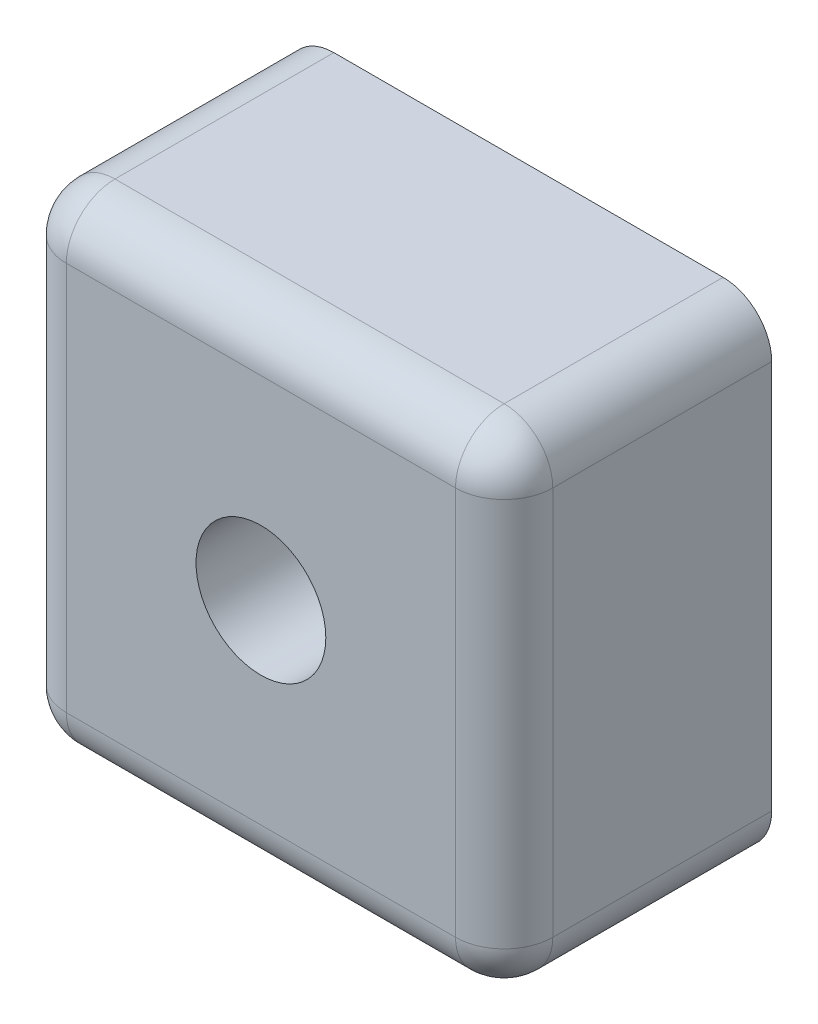
ISO-10303-21;
HEADER;
FILE_DESCRIPTION(('STEP AP214'),'2;1');
FILE_NAME('part.step','',(''),(''),'','','');
FILE_SCHEMA(('AUTOMOTIVE_DESIGN { 1 0 10303 214 1 1 1 1 }'));
ENDSEC;
DATA;
#1=APPLICATION_CONTEXT('core data for automotive mechanical design processes');
#2=APPLICATION_PROTOCOL_DEFINITION('international standard','automotive_design',2000,#1);
#3=PRODUCT_CONTEXT('',#1,'mechanical');
#4=PRODUCT('Part','Part','',(#3));
#5=PRODUCT_RELATED_PRODUCT_CATEGORY('part','',(#4));
#6=PRODUCT_DEFINITION_FORMATION('','',#4);
#7=PRODUCT_DEFINITION_CONTEXT('part definition',#1,'design');
#8=PRODUCT_DEFINITION('design','',#6,#7);
#9=PRODUCT_DEFINITION_SHAPE('','',#8);
#10=(LENGTH_UNIT() NAMED_UNIT(*) SI_UNIT(.MILLI.,.METRE.));
#11=(NAMED_UNIT(*) PLANE_ANGLE_UNIT() SI_UNIT($,.RADIAN.));
#12=(NAMED_UNIT(*) SI_UNIT($,.STERADIAN.) SOLID_ANGLE_UNIT());
#13=UNCERTAINTY_MEASURE_WITH_UNIT(LENGTH_MEASURE(1.E-05),#10,'distance_accuracy_value','');
#14=(GEOMETRIC_REPRESENTATION_CONTEXT(3) GLOBAL_UNCERTAINTY_ASSIGNED_CONTEXT((#13)) GLOBAL_UNIT_ASSIGNED_CONTEXT((#10,
#11,#12)) REPRESENTATION_CONTEXT('',''));
#15=CARTESIAN_POINT('',(0.,0.,0.));
#16=DIRECTION('',(0.,0.,1.));
#17=DIRECTION('',(1.,0.,0.));
#18=AXIS2_PLACEMENT_3D('',#15,#16,#17);
#19=CARTESIAN_POINT('',(50.,0.,55.));
#20=DIRECTION('',(-1.,0.,0.));
#21=DIRECTION('',(0.,0.,1.));
#22=AXIS2_PLACEMENT_3D('',#19,#20,#21);
#23=PLANE('',#22);
#24=DIRECTION('',(0.,0.,-1.));
#25=VECTOR('',#24,1.);
#26=CARTESIAN_POINT('',(50.,40.,55.));
#27=LINE('',#26,#25);
#28=CARTESIAN_POINT('',(50.,40.,0.));
#29=VERTEX_POINT('',#28);
#30=CARTESIAN_POINT('',(50.,40.,45.));
#31=VERTEX_POINT('',#30);
#32=EDGE_CURVE('E159',#29,#31,#27,.F.);
#33=ORIENTED_EDGE('',*,*,#32,.T.);
#34=DIRECTION('',(0.,1.,0.));
#35=VECTOR('',#34,1.);
#36=CARTESIAN_POINT('',(50.,-40.,45.));
#37=LINE('',#36,#35);
#38=CARTESIAN_POINT('',(50.,-40.,45.));
#39=VERTEX_POINT('',#38);
#40=EDGE_CURVE('E186',#31,#39,#37,.F.);
#41=ORIENTED_EDGE('',*,*,#40,.T.);
#42=DIRECTION('',(0.,0.,-1.));
#43=VECTOR('',#42,1.);
#44=CARTESIAN_POINT('',(50.,-40.,55.));
#45=LINE('',#44,#43);
#46=CARTESIAN_POINT('',(50.,-40.,0.));
#47=VERTEX_POINT('',#46);
#48=EDGE_CURVE('E161',#39,#47,#45,.T.);
#49=ORIENTED_EDGE('',*,*,#48,.T.);
#50=DIRECTION('',(0.,1.,0.));
#51=VECTOR('',#50,1.);
#52=CARTESIAN_POINT('',(50.,0.,0.));
#53=LINE('',#52,#51);
#54=EDGE_CURVE('E216',#47,#29,#53,.T.);
#55=ORIENTED_EDGE('',*,*,#54,.T.);
#56=EDGE_LOOP('',(#33,#41,#49,#55));
#57=FACE_BOUND('',#56,.T.);
#58=ADVANCED_FACE('F37',(#57),#23,.F.);
#59=CARTESIAN_POINT('',(0.,50.,55.));
#60=DIRECTION('',(0.,1.,0.));
#61=DIRECTION('',(0.,0.,1.));
#62=AXIS2_PLACEMENT_3D('',#59,#60,#61);
#63=PLANE('',#62);
#64=DIRECTION('',(0.,0.,-1.));
#65=VECTOR('',#64,1.);
#66=CARTESIAN_POINT('',(-40.,50.,55.));
#67=LINE('',#66,#65);
#68=CARTESIAN_POINT('',(-40.,50.,0.));
#69=VERTEX_POINT('',#68);
#70=CARTESIAN_POINT('',(-40.,50.,45.));
#71=VERTEX_POINT('',#70);
#72=EDGE_CURVE('E163',#69,#71,#67,.F.);
#73=ORIENTED_EDGE('',*,*,#72,.T.);
#74=DIRECTION('',(1.,0.,0.));
#75=VECTOR('',#74,1.);
#76=CARTESIAN_POINT('',(0.,50.,45.));
#77=LINE('',#76,#75);
#78=CARTESIAN_POINT('',(40.,50.,45.));
#79=VERTEX_POINT('',#78);
#80=EDGE_CURVE('E11',#71,#79,#77,.T.);
#81=ORIENTED_EDGE('',*,*,#80,.T.);
#82=DIRECTION('',(0.,0.,-1.));
#83=VECTOR('',#82,1.);
#84=CARTESIAN_POINT('',(40.,50.,0.));
#85=LINE('',#84,#83);
#86=CARTESIAN_POINT('',(40.,50.,0.));
#87=VERTEX_POINT('',#86);
#88=EDGE_CURVE('E165',#79,#87,#85,.T.);
#89=ORIENTED_EDGE('',*,*,#88,.T.);
#90=DIRECTION('',(1.,0.,0.));
#91=VECTOR('',#90,1.);
#92=CARTESIAN_POINT('',(0.,50.,0.));
#93=LINE('',#92,#91);
#94=EDGE_CURVE('E148',#69,#87,#93,.T.);
#95=ORIENTED_EDGE('',*,*,#94,.F.);
#96=EDGE_LOOP('',(#73,#81,#89,#95));
#97=FACE_BOUND('',#96,.T.);
#98=ADVANCED_FACE('F227',(#97),#63,.T.);
#99=CARTESIAN_POINT('',(-50.,0.,55.));
#100=DIRECTION('',(-1.,0.,0.));
#101=DIRECTION('',(0.,0.,1.));
#102=AXIS2_PLACEMENT_3D('',#99,#100,#101);
#103=PLANE('',#102);
#104=DIRECTION('',(0.,0.,-1.));
#105=VECTOR('',#104,1.);
#106=CARTESIAN_POINT('',(-50.,-40.,55.));
#107=LINE('',#106,#105);
#108=CARTESIAN_POINT('',(-50.,-40.,0.));
#109=VERTEX_POINT('',#108);
#110=CARTESIAN_POINT('',(-50.,-40.,45.));
#111=VERTEX_POINT('',#110);
#112=EDGE_CURVE('E133',#109,#111,#107,.F.);
#113=ORIENTED_EDGE('',*,*,#112,.T.);
#114=DIRECTION('',(0.,1.,0.));
#115=VECTOR('',#114,1.);
#116=CARTESIAN_POINT('',(-50.,0.,45.));
#117=LINE('',#116,#115);
#118=CARTESIAN_POINT('',(-50.,40.,45.));
#119=VERTEX_POINT('',#118);
#120=EDGE_CURVE('E170',#111,#119,#117,.T.);
#121=ORIENTED_EDGE('',*,*,#120,.T.);
#122=DIRECTION('',(0.,0.,-1.));
#123=VECTOR('',#122,1.);
#124=CARTESIAN_POINT('',(-50.,40.,55.));
#125=LINE('',#124,#123);
#126=CARTESIAN_POINT('',(-50.,40.,0.));
#127=VERTEX_POINT('',#126);
#128=EDGE_CURVE('E137',#119,#127,#125,.T.);
#129=ORIENTED_EDGE('',*,*,#128,.T.);
#130=DIRECTION('',(0.,1.,0.));
#131=VECTOR('',#130,1.);
#132=CARTESIAN_POINT('',(-50.,0.,0.));
#133=LINE('',#132,#131);
#134=EDGE_CURVE('E144',#109,#127,#133,.T.);
#135=ORIENTED_EDGE('',*,*,#134,.F.);
#136=EDGE_LOOP('',(#113,#121,#129,#135));
#137=FACE_BOUND('',#136,.T.);
#138=ADVANCED_FACE('F261',(#137),#103,.T.);
#139=CARTESIAN_POINT('',(0.,0.,55.));
#140=DIRECTION('',(0.,0.,-1.));
#141=DIRECTION('',(-1.,0.,0.));
#142=AXIS2_PLACEMENT_3D('',#139,#140,#141);
#143=CYLINDRICAL_SURFACE('',#142,13.33983914613);
#144=CARTESIAN_POINT('',(0.,0.,55.));
#145=DIRECTION('',(0.,0.,1.));
#146=DIRECTION('',(1.,0.,0.));
#147=AXIS2_PLACEMENT_3D('',#144,#145,#146);
#148=CIRCLE('',#147,13.33983914613);
#149=CARTESIAN_POINT('',(13.33983914613,0.,55.));
#150=VERTEX_POINT('',#149);
#151=EDGE_CURVE('E143',#150,#150,#148,.T.);
#152=ORIENTED_EDGE('',*,*,#151,.T.);
#153=EDGE_LOOP('',(#152));
#154=FACE_BOUND('',#153,.T.);
#155=CARTESIAN_POINT('',(0.,0.,0.));
#156=DIRECTION('',(0.,0.,1.));
#157=DIRECTION('',(1.,0.,0.));
#158=AXIS2_PLACEMENT_3D('',#155,#156,#157);
#159=CIRCLE('',#158,13.33983914613);
#160=CARTESIAN_POINT('',(13.33983914613,0.,0.));
#161=VERTEX_POINT('',#160);
#162=EDGE_CURVE('E211',#161,#161,#159,.T.);
#163=ORIENTED_EDGE('',*,*,#162,.F.);
#164=EDGE_LOOP('',(#163));
#165=FACE_BOUND('',#164,.T.);
#166=ADVANCED_FACE('F263',(#154,#165),#143,.F.);
#167=CARTESIAN_POINT('',(0.,-50.,55.));
#168=DIRECTION('',(0.,1.,0.));
#169=DIRECTION('',(0.,0.,1.));
#170=AXIS2_PLACEMENT_3D('',#167,#168,#169);
#171=PLANE('',#170);
#172=DIRECTION('',(0.,0.,-1.));
#173=VECTOR('',#172,1.);
#174=CARTESIAN_POINT('',(40.,-50.,55.));
#175=LINE('',#174,#173);
#176=CARTESIAN_POINT('',(40.,-50.,0.));
#177=VERTEX_POINT('',#176);
#178=CARTESIAN_POINT('',(40.,-50.,45.));
#179=VERTEX_POINT('',#178);
#180=EDGE_CURVE('E127',#177,#179,#175,.F.);
#181=ORIENTED_EDGE('',*,*,#180,.T.);
#182=DIRECTION('',(1.,0.,0.));
#183=VECTOR('',#182,1.);
#184=CARTESIAN_POINT('',(-40.,-50.,45.));
#185=LINE('',#184,#183);
#186=CARTESIAN_POINT('',(-40.,-50.,45.));
#187=VERTEX_POINT('',#186);
#188=EDGE_CURVE('E123',#179,#187,#185,.F.);
#189=ORIENTED_EDGE('',*,*,#188,.T.);
#190=DIRECTION('',(0.,0.,-1.));
#191=VECTOR('',#190,1.);
#192=CARTESIAN_POINT('',(-40.,-50.,0.));
#193=LINE('',#192,#191);
#194=CARTESIAN_POINT('',(-40.,-50.,0.));
#195=VERTEX_POINT('',#194);
#196=EDGE_CURVE('E115',#187,#195,#193,.T.);
#197=ORIENTED_EDGE('',*,*,#196,.T.);
#198=DIRECTION('',(1.,0.,0.));
#199=VECTOR('',#198,1.);
#200=CARTESIAN_POINT('',(0.,-50.,0.));
#201=LINE('',#200,#199);
#202=EDGE_CURVE('E120',#195,#177,#201,.T.);
#203=ORIENTED_EDGE('',*,*,#202,.T.);
#204=EDGE_LOOP('',(#181,#189,#197,#203));
#205=FACE_BOUND('',#204,.T.);
#206=ADVANCED_FACE('F118',(#205),#171,.F.);
#207=CARTESIAN_POINT('',(0.,0.,55.));
#208=DIRECTION('',(0.,0.,1.));
#209=DIRECTION('',(1.,0.,0.));
#210=AXIS2_PLACEMENT_3D('',#207,#208,#209);
#211=PLANE('',#210);
#212=DIRECTION('',(1.,0.,0.));
#213=VECTOR('',#212,1.);
#214=CARTESIAN_POINT('',(0.,40.,55.));
#215=LINE('',#214,#213);
#216=CARTESIAN_POINT('',(40.,40.,55.));
#217=VERTEX_POINT('',#216);
#218=CARTESIAN_POINT('',(-40.,40.,55.));
#219=VERTEX_POINT('',#218);
#220=EDGE_CURVE('E172',#217,#219,#215,.F.);
#221=ORIENTED_EDGE('',*,*,#220,.T.);
#222=DIRECTION('',(0.,1.,0.));
#223=VECTOR('',#222,1.);
#224=CARTESIAN_POINT('',(-40.,0.,55.));
#225=LINE('',#224,#223);
#226=CARTESIAN_POINT('',(-40.,-40.,55.));
#227=VERTEX_POINT('',#226);
#228=EDGE_CURVE('E178',#219,#227,#225,.F.);
#229=ORIENTED_EDGE('',*,*,#228,.T.);
#230=DIRECTION('',(1.,0.,0.));
#231=VECTOR('',#230,1.);
#232=CARTESIAN_POINT('',(40.,-40.,55.));
#233=LINE('',#232,#231);
#234=CARTESIAN_POINT('',(40.,-40.,55.));
#235=VERTEX_POINT('',#234);
#236=EDGE_CURVE('E176',#227,#235,#233,.T.);
#237=ORIENTED_EDGE('',*,*,#236,.T.);
#238=DIRECTION('',(0.,1.,0.));
#239=VECTOR('',#238,1.);
#240=CARTESIAN_POINT('',(40.,40.,55.));
#241=LINE('',#240,#239);
#242=EDGE_CURVE('E174',#235,#217,#241,.T.);
#243=ORIENTED_EDGE('',*,*,#242,.T.);
#244=EDGE_LOOP('',(#221,#229,#237,#243));
#245=FACE_BOUND('',#244,.T.);
#246=ORIENTED_EDGE('',*,*,#151,.F.);
#247=EDGE_LOOP('',(#246));
#248=FACE_BOUND('',#247,.T.);
#249=ADVANCED_FACE('F327',(#245,#248),#211,.T.);
#250=CARTESIAN_POINT('',(0.,0.,0.));
#251=DIRECTION('',(0.,0.,1.));
#252=DIRECTION('',(1.,0.,0.));
#253=AXIS2_PLACEMENT_3D('',#250,#251,#252);
#254=PLANE('',#253);
#255=ORIENTED_EDGE('',*,*,#162,.T.);
#256=EDGE_LOOP('',(#255));
#257=FACE_BOUND('',#256,.T.);
#258=ORIENTED_EDGE('',*,*,#202,.F.);
#259=CARTESIAN_POINT('',(-40.,-40.,0.));
#260=DIRECTION('',(0.,0.,1.));
#261=DIRECTION('',(1.,0.,0.));
#262=AXIS2_PLACEMENT_3D('',#259,#260,#261);
#263=CIRCLE('',#262,10.);
#264=EDGE_CURVE('E130',#195,#109,#263,.F.);
#265=ORIENTED_EDGE('',*,*,#264,.T.);
#266=ORIENTED_EDGE('',*,*,#134,.T.);
#267=CARTESIAN_POINT('',(-40.,40.,0.));
#268=DIRECTION('',(0.,0.,1.));
#269=DIRECTION('',(1.,0.,0.));
#270=AXIS2_PLACEMENT_3D('',#267,#268,#269);
#271=CIRCLE('',#270,10.);
#272=EDGE_CURVE('E126',#127,#69,#271,.F.);
#273=ORIENTED_EDGE('',*,*,#272,.T.);
#274=ORIENTED_EDGE('',*,*,#94,.T.);
#275=CARTESIAN_POINT('',(40.,40.,0.));
#276=DIRECTION('',(0.,0.,1.));
#277=DIRECTION('',(1.,0.,0.));
#278=AXIS2_PLACEMENT_3D('',#275,#276,#277);
#279=CIRCLE('',#278,10.);
#280=EDGE_CURVE('E154',#87,#29,#279,.F.);
#281=ORIENTED_EDGE('',*,*,#280,.T.);
#282=ORIENTED_EDGE('',*,*,#54,.F.);
#283=CARTESIAN_POINT('',(40.,-40.,0.));
#284=DIRECTION('',(0.,0.,1.));
#285=DIRECTION('',(1.,0.,0.));
#286=AXIS2_PLACEMENT_3D('',#283,#284,#285);
#287=CIRCLE('',#286,10.);
#288=EDGE_CURVE('E138',#47,#177,#287,.F.);
#289=ORIENTED_EDGE('',*,*,#288,.T.);
#290=EDGE_LOOP('',(#258,#265,#266,#273,#274,#281,#282,#289));
#291=FACE_BOUND('',#290,.T.);
#292=ADVANCED_FACE('F140',(#257,#291),#254,.F.);
#293=CARTESIAN_POINT('',(-40.,-40.,55.));
#294=DIRECTION('',(0.,0.,1.));
#295=DIRECTION('',(1.,0.,0.));
#296=AXIS2_PLACEMENT_3D('',#293,#294,#295);
#297=CYLINDRICAL_SURFACE('',#296,10.);
#298=ORIENTED_EDGE('',*,*,#196,.F.);
#299=CARTESIAN_POINT('',(-40.,-40.,45.));
#300=DIRECTION('',(0.,0.,1.));
#301=DIRECTION('',(1.,0.,0.));
#302=AXIS2_PLACEMENT_3D('',#299,#300,#301);
#303=CIRCLE('',#302,10.);
#304=EDGE_CURVE('E181',#187,#111,#303,.F.);
#305=ORIENTED_EDGE('',*,*,#304,.T.);
#306=ORIENTED_EDGE('',*,*,#112,.F.);
#307=ORIENTED_EDGE('',*,*,#264,.F.);
#308=EDGE_LOOP('',(#298,#305,#306,#307));
#309=FACE_BOUND('',#308,.T.);
#310=ADVANCED_FACE('F131',(#309),#297,.T.);
#311=CARTESIAN_POINT('',(40.,-40.,55.));
#312=DIRECTION('',(0.,0.,-1.));
#313=DIRECTION('',(-1.,0.,0.));
#314=AXIS2_PLACEMENT_3D('',#311,#312,#313);
#315=CYLINDRICAL_SURFACE('',#314,10.);
#316=ORIENTED_EDGE('',*,*,#48,.F.);
#317=CARTESIAN_POINT('',(40.,-40.,45.));
#318=DIRECTION('',(0.,0.,-1.));
#319=DIRECTION('',(-1.,0.,0.));
#320=AXIS2_PLACEMENT_3D('',#317,#318,#319);
#321=CIRCLE('',#320,10.);
#322=EDGE_CURVE('E184',#39,#179,#321,.T.);
#323=ORIENTED_EDGE('',*,*,#322,.T.);
#324=ORIENTED_EDGE('',*,*,#180,.F.);
#325=ORIENTED_EDGE('',*,*,#288,.F.);
#326=EDGE_LOOP('',(#316,#323,#324,#325));
#327=FACE_BOUND('',#326,.T.);
#328=ADVANCED_FACE('F254',(#327),#315,.T.);
#329=CARTESIAN_POINT('',(40.,40.,55.));
#330=DIRECTION('',(0.,0.,1.));
#331=DIRECTION('',(1.,0.,0.));
#332=AXIS2_PLACEMENT_3D('',#329,#330,#331);
#333=CYLINDRICAL_SURFACE('',#332,10.);
#334=ORIENTED_EDGE('',*,*,#88,.F.);
#335=CARTESIAN_POINT('',(40.,40.,45.));
#336=DIRECTION('',(0.,0.,1.));
#337=DIRECTION('',(1.,0.,0.));
#338=AXIS2_PLACEMENT_3D('',#335,#336,#337);
#339=CIRCLE('',#338,10.);
#340=EDGE_CURVE('E46',#79,#31,#339,.F.);
#341=ORIENTED_EDGE('',*,*,#340,.T.);
#342=ORIENTED_EDGE('',*,*,#32,.F.);
#343=ORIENTED_EDGE('',*,*,#280,.F.);
#344=EDGE_LOOP('',(#334,#341,#342,#343));
#345=FACE_BOUND('',#344,.T.);
#346=ADVANCED_FACE('F282',(#345),#333,.T.);
#347=CARTESIAN_POINT('',(-40.,40.,55.));
#348=DIRECTION('',(0.,0.,-1.));
#349=DIRECTION('',(-1.,0.,0.));
#350=AXIS2_PLACEMENT_3D('',#347,#348,#349);
#351=CYLINDRICAL_SURFACE('',#350,10.);
#352=ORIENTED_EDGE('',*,*,#128,.F.);
#353=CARTESIAN_POINT('',(-40.,40.,45.));
#354=DIRECTION('',(0.,0.,-1.));
#355=DIRECTION('',(-1.,0.,0.));
#356=AXIS2_PLACEMENT_3D('',#353,#354,#355);
#357=CIRCLE('',#356,10.);
#358=EDGE_CURVE('E167',#119,#71,#357,.T.);
#359=ORIENTED_EDGE('',*,*,#358,.T.);
#360=ORIENTED_EDGE('',*,*,#72,.F.);
#361=ORIENTED_EDGE('',*,*,#272,.F.);
#362=EDGE_LOOP('',(#352,#359,#360,#361));
#363=FACE_BOUND('',#362,.T.);
#364=ADVANCED_FACE('F230',(#363),#351,.T.);
#365=CARTESIAN_POINT('',(40.,-40.,45.));
#366=DIRECTION('',(0.,0.,1.));
#367=DIRECTION('',(1.,0.,0.));
#368=AXIS2_PLACEMENT_3D('',#365,#366,#367);
#369=SPHERICAL_SURFACE('',#368,10.);
#370=CARTESIAN_POINT('',(40.,-40.,45.));
#371=DIRECTION('',(-1.,0.,0.));
#372=DIRECTION('',(0.,0.,1.));
#373=AXIS2_PLACEMENT_3D('',#370,#371,#372);
#374=CIRCLE('',#373,10.);
#375=EDGE_CURVE('E204',#179,#235,#374,.T.);
#376=ORIENTED_EDGE('',*,*,#375,.F.);
#377=ORIENTED_EDGE('',*,*,#322,.F.);
#378=CARTESIAN_POINT('',(40.,-40.,45.));
#379=DIRECTION('',(0.,1.,0.));
#380=DIRECTION('',(0.,0.,1.));
#381=AXIS2_PLACEMENT_3D('',#378,#379,#380);
#382=CIRCLE('',#381,10.);
#383=EDGE_CURVE('E41',#235,#39,#382,.T.);
#384=ORIENTED_EDGE('',*,*,#383,.F.);
#385=EDGE_LOOP('',(#376,#377,#384));
#386=FACE_BOUND('',#385,.T.);
#387=ADVANCED_FACE('F39',(#386),#369,.T.);
#388=CARTESIAN_POINT('',(40.,0.,45.));
#389=DIRECTION('',(0.,-1.,0.));
#390=DIRECTION('',(0.,0.,-1.));
#391=AXIS2_PLACEMENT_3D('',#388,#389,#390);
#392=CYLINDRICAL_SURFACE('',#391,10.);
#393=ORIENTED_EDGE('',*,*,#383,.T.);
#394=ORIENTED_EDGE('',*,*,#40,.F.);
#395=CARTESIAN_POINT('',(40.,40.,45.));
#396=DIRECTION('',(0.,1.,0.));
#397=DIRECTION('',(0.,0.,1.));
#398=AXIS2_PLACEMENT_3D('',#395,#396,#397);
#399=CIRCLE('',#398,10.);
#400=EDGE_CURVE('E202',#217,#31,#399,.T.);
#401=ORIENTED_EDGE('',*,*,#400,.F.);
#402=ORIENTED_EDGE('',*,*,#242,.F.);
#403=EDGE_LOOP('',(#393,#394,#401,#402));
#404=FACE_BOUND('',#403,.T.);
#405=ADVANCED_FACE('F249',(#404),#392,.T.);
#406=CARTESIAN_POINT('',(0.,-40.,45.));
#407=DIRECTION('',(-1.,0.,0.));
#408=DIRECTION('',(0.,0.,1.));
#409=AXIS2_PLACEMENT_3D('',#406,#407,#408);
#410=CYLINDRICAL_SURFACE('',#409,10.);
#411=ORIENTED_EDGE('',*,*,#375,.T.);
#412=ORIENTED_EDGE('',*,*,#236,.F.);
#413=CARTESIAN_POINT('',(-40.,-40.,45.));
#414=DIRECTION('',(-1.,0.,0.));
#415=DIRECTION('',(0.,0.,1.));
#416=AXIS2_PLACEMENT_3D('',#413,#414,#415);
#417=CIRCLE('',#416,10.);
#418=EDGE_CURVE('E199',#187,#227,#417,.T.);
#419=ORIENTED_EDGE('',*,*,#418,.F.);
#420=ORIENTED_EDGE('',*,*,#188,.F.);
#421=EDGE_LOOP('',(#411,#412,#419,#420));
#422=FACE_BOUND('',#421,.T.);
#423=ADVANCED_FACE('F256',(#422),#410,.T.);
#424=CARTESIAN_POINT('',(40.,40.,45.));
#425=DIRECTION('',(0.,0.,1.));
#426=DIRECTION('',(1.,0.,0.));
#427=AXIS2_PLACEMENT_3D('',#424,#425,#426);
#428=SPHERICAL_SURFACE('',#427,10.);
#429=ORIENTED_EDGE('',*,*,#400,.T.);
#430=ORIENTED_EDGE('',*,*,#340,.F.);
#431=CARTESIAN_POINT('',(40.,40.,45.));
#432=DIRECTION('',(-1.,0.,0.));
#433=DIRECTION('',(0.,0.,1.));
#434=AXIS2_PLACEMENT_3D('',#431,#432,#433);
#435=CIRCLE('',#434,10.);
#436=EDGE_CURVE('E196',#217,#79,#435,.T.);
#437=ORIENTED_EDGE('',*,*,#436,.F.);
#438=EDGE_LOOP('',(#429,#430,#437));
#439=FACE_BOUND('',#438,.T.);
#440=ADVANCED_FACE('F247',(#439),#428,.T.);
#441=CARTESIAN_POINT('',(-40.,-40.,45.));
#442=DIRECTION('',(0.,0.,1.));
#443=DIRECTION('',(1.,0.,0.));
#444=AXIS2_PLACEMENT_3D('',#441,#442,#443);
#445=SPHERICAL_SURFACE('',#444,10.);
#446=ORIENTED_EDGE('',*,*,#304,.F.);
#447=ORIENTED_EDGE('',*,*,#418,.T.);
#448=CARTESIAN_POINT('',(-40.,-40.,45.));
#449=DIRECTION('',(0.,1.,0.));
#450=DIRECTION('',(0.,0.,1.));
#451=AXIS2_PLACEMENT_3D('',#448,#449,#450);
#452=CIRCLE('',#451,10.);
#453=EDGE_CURVE('E194',#111,#227,#452,.T.);
#454=ORIENTED_EDGE('',*,*,#453,.F.);
#455=EDGE_LOOP('',(#446,#447,#454));
#456=FACE_BOUND('',#455,.T.);
#457=ADVANCED_FACE('F259',(#456),#445,.T.);
#458=CARTESIAN_POINT('',(0.,40.,45.));
#459=DIRECTION('',(1.,0.,0.));
#460=DIRECTION('',(0.,0.,-1.));
#461=AXIS2_PLACEMENT_3D('',#458,#459,#460);
#462=CYLINDRICAL_SURFACE('',#461,10.);
#463=ORIENTED_EDGE('',*,*,#436,.T.);
#464=ORIENTED_EDGE('',*,*,#80,.F.);
#465=CARTESIAN_POINT('',(-40.,40.,45.));
#466=DIRECTION('',(-1.,0.,0.));
#467=DIRECTION('',(0.,0.,1.));
#468=AXIS2_PLACEMENT_3D('',#465,#466,#467);
#469=CIRCLE('',#468,10.);
#470=EDGE_CURVE('E192',#219,#71,#469,.T.);
#471=ORIENTED_EDGE('',*,*,#470,.F.);
#472=ORIENTED_EDGE('',*,*,#220,.F.);
#473=EDGE_LOOP('',(#463,#464,#471,#472));
#474=FACE_BOUND('',#473,.T.);
#475=ADVANCED_FACE('F244',(#474),#462,.T.);
#476=CARTESIAN_POINT('',(-40.,0.,45.));
#477=DIRECTION('',(0.,1.,0.));
#478=DIRECTION('',(0.,0.,1.));
#479=AXIS2_PLACEMENT_3D('',#476,#477,#478);
#480=CYLINDRICAL_SURFACE('',#479,10.);
#481=ORIENTED_EDGE('',*,*,#453,.T.);
#482=ORIENTED_EDGE('',*,*,#228,.F.);
#483=CARTESIAN_POINT('',(-40.,40.,45.));
#484=DIRECTION('',(0.,1.,0.));
#485=DIRECTION('',(0.,0.,1.));
#486=AXIS2_PLACEMENT_3D('',#483,#484,#485);
#487=CIRCLE('',#486,10.);
#488=EDGE_CURVE('E189',#119,#219,#487,.T.);
#489=ORIENTED_EDGE('',*,*,#488,.F.);
#490=ORIENTED_EDGE('',*,*,#120,.F.);
#491=EDGE_LOOP('',(#481,#482,#489,#490));
#492=FACE_BOUND('',#491,.T.);
#493=ADVANCED_FACE('F239',(#492),#480,.T.);
#494=CARTESIAN_POINT('',(-40.,40.,45.));
#495=DIRECTION('',(0.,0.,1.));
#496=DIRECTION('',(1.,0.,0.));
#497=AXIS2_PLACEMENT_3D('',#494,#495,#496);
#498=SPHERICAL_SURFACE('',#497,10.);
#499=ORIENTED_EDGE('',*,*,#470,.T.);
#500=ORIENTED_EDGE('',*,*,#358,.F.);
#501=ORIENTED_EDGE('',*,*,#488,.T.);
#502=EDGE_LOOP('',(#499,#500,#501));
#503=FACE_BOUND('',#502,.T.);
#504=ADVANCED_FACE('F234',(#503),#498,.T.);
#505=CLOSED_SHELL('',(#58,#98,#138,#166,#206,#249,#292,#310,#328,#346,#364,#387,#405,#423,#440,
#457,#475,#493,#504));
#506=MANIFOLD_SOLID_BREP('B2',#505);
#507=ADVANCED_BREP_SHAPE_REPRESENTATION('',(#18,#506),#14);
#508=SHAPE_DEFINITION_REPRESENTATION(#9,#507);
ENDSEC;
END-ISO-10303-21;
